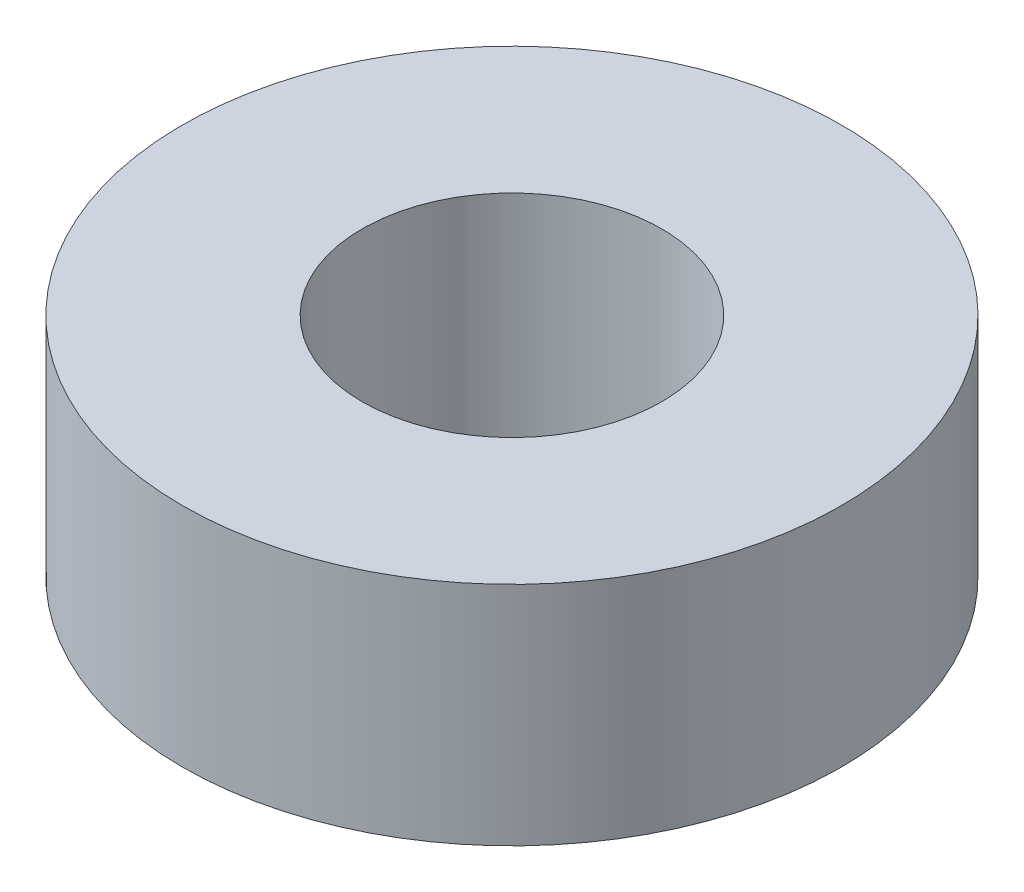
ISO-10303-21;
HEADER;
FILE_DESCRIPTION(('STEP AP214'),'2;1');
FILE_NAME('part.step','',(''),(''),'','','');
FILE_SCHEMA(('AUTOMOTIVE_DESIGN { 1 0 10303 214 1 1 1 1 }'));
ENDSEC;
DATA;
#1=APPLICATION_CONTEXT('core data for automotive mechanical design processes');
#2=APPLICATION_PROTOCOL_DEFINITION('international standard','automotive_design',2000,#1);
#3=PRODUCT_CONTEXT('',#1,'mechanical');
#4=PRODUCT('Part','Part','',(#3));
#5=PRODUCT_RELATED_PRODUCT_CATEGORY('part','',(#4));
#6=PRODUCT_DEFINITION_FORMATION('','',#4);
#7=PRODUCT_DEFINITION_CONTEXT('part definition',#1,'design');
#8=PRODUCT_DEFINITION('design','',#6,#7);
#9=PRODUCT_DEFINITION_SHAPE('','',#8);
#10=(LENGTH_UNIT() NAMED_UNIT(*) SI_UNIT(.MILLI.,.METRE.));
#11=(NAMED_UNIT(*) PLANE_ANGLE_UNIT() SI_UNIT($,.RADIAN.));
#12=(NAMED_UNIT(*) SI_UNIT($,.STERADIAN.) SOLID_ANGLE_UNIT());
#13=UNCERTAINTY_MEASURE_WITH_UNIT(LENGTH_MEASURE(1.E-05),#10,'distance_accuracy_value','');
#14=(GEOMETRIC_REPRESENTATION_CONTEXT(3) GLOBAL_UNCERTAINTY_ASSIGNED_CONTEXT((#13)) GLOBAL_UNIT_ASSIGNED_CONTEXT((#10,
#11,#12)) REPRESENTATION_CONTEXT('',''));
#15=CARTESIAN_POINT('',(0.,0.,0.));
#16=DIRECTION('',(0.,0.,1.));
#17=DIRECTION('',(1.,0.,0.));
#18=AXIS2_PLACEMENT_3D('',#15,#16,#17);
#19=CARTESIAN_POINT('',(0.,12.,0.));
#20=DIRECTION('',(0.,1.,0.));
#21=DIRECTION('',(0.,0.,1.));
#22=AXIS2_PLACEMENT_3D('',#19,#20,#21);
#23=PLANE('',#22);
#24=CARTESIAN_POINT('',(0.,12.,0.));
#25=DIRECTION('',(0.,1.,0.));
#26=DIRECTION('',(0.,0.,1.));
#27=AXIS2_PLACEMENT_3D('',#24,#25,#26);
#28=CIRCLE('',#27,17.4625);
#29=CARTESIAN_POINT('',(0.,12.,17.4625));
#30=VERTEX_POINT('',#29);
#31=EDGE_CURVE('E10',#30,#30,#28,.T.);
#32=ORIENTED_EDGE('',*,*,#31,.T.);
#33=EDGE_LOOP('',(#32));
#34=FACE_BOUND('',#33,.T.);
#35=CARTESIAN_POINT('',(0.,12.,0.));
#36=DIRECTION('',(0.,1.,0.));
#37=DIRECTION('',(0.,0.,1.));
#38=AXIS2_PLACEMENT_3D('',#35,#36,#37);
#39=CIRCLE('',#38,7.9375);
#40=CARTESIAN_POINT('',(0.,12.,7.9375));
#41=VERTEX_POINT('',#40);
#42=EDGE_CURVE('E42',#41,#41,#39,.T.);
#43=ORIENTED_EDGE('',*,*,#42,.F.);
#44=EDGE_LOOP('',(#43));
#45=FACE_BOUND('',#44,.T.);
#46=ADVANCED_FACE('F31',(#34,#45),#23,.T.);
#47=CARTESIAN_POINT('',(0.,0.,0.));
#48=DIRECTION('',(0.,1.,0.));
#49=DIRECTION('',(0.,0.,1.));
#50=AXIS2_PLACEMENT_3D('',#47,#48,#49);
#51=PLANE('',#50);
#52=CARTESIAN_POINT('',(0.,0.,0.));
#53=DIRECTION('',(0.,1.,0.));
#54=DIRECTION('',(0.,0.,1.));
#55=AXIS2_PLACEMENT_3D('',#52,#53,#54);
#56=CIRCLE('',#55,17.4625);
#57=CARTESIAN_POINT('',(0.,0.,17.4625));
#58=VERTEX_POINT('',#57);
#59=EDGE_CURVE('E35',#58,#58,#56,.T.);
#60=ORIENTED_EDGE('',*,*,#59,.F.);
#61=EDGE_LOOP('',(#60));
#62=FACE_BOUND('',#61,.T.);
#63=CARTESIAN_POINT('',(0.,0.,0.));
#64=DIRECTION('',(0.,1.,0.));
#65=DIRECTION('',(0.,0.,1.));
#66=AXIS2_PLACEMENT_3D('',#63,#64,#65);
#67=CIRCLE('',#66,7.9375);
#68=CARTESIAN_POINT('',(0.,0.,7.9375));
#69=VERTEX_POINT('',#68);
#70=EDGE_CURVE('E44',#69,#69,#67,.T.);
#71=ORIENTED_EDGE('',*,*,#70,.T.);
#72=EDGE_LOOP('',(#71));
#73=FACE_BOUND('',#72,.T.);
#74=ADVANCED_FACE('F54',(#62,#73),#51,.F.);
#75=CARTESIAN_POINT('',(0.,12.,0.));
#76=DIRECTION('',(0.,-1.,0.));
#77=DIRECTION('',(0.,0.,-1.));
#78=AXIS2_PLACEMENT_3D('',#75,#76,#77);
#79=CYLINDRICAL_SURFACE('',#78,17.4625);
#80=ORIENTED_EDGE('',*,*,#31,.F.);
#81=EDGE_LOOP('',(#80));
#82=FACE_BOUND('',#81,.T.);
#83=ORIENTED_EDGE('',*,*,#59,.T.);
#84=EDGE_LOOP('',(#83));
#85=FACE_BOUND('',#84,.T.);
#86=ADVANCED_FACE('F33',(#82,#85),#79,.T.);
#87=CARTESIAN_POINT('',(0.,12.,0.));
#88=DIRECTION('',(0.,-1.,0.));
#89=DIRECTION('',(0.,0.,-1.));
#90=AXIS2_PLACEMENT_3D('',#87,#88,#89);
#91=CYLINDRICAL_SURFACE('',#90,7.9375);
#92=ORIENTED_EDGE('',*,*,#42,.T.);
#93=EDGE_LOOP('',(#92));
#94=FACE_BOUND('',#93,.T.);
#95=ORIENTED_EDGE('',*,*,#70,.F.);
#96=EDGE_LOOP('',(#95));
#97=FACE_BOUND('',#96,.T.);
#98=ADVANCED_FACE('F50',(#94,#97),#91,.F.);
#99=CLOSED_SHELL('',(#46,#74,#86,#98));
#100=MANIFOLD_SOLID_BREP('B2',#99);
#101=ADVANCED_BREP_SHAPE_REPRESENTATION('',(#18,#100),#14);
#102=SHAPE_DEFINITION_REPRESENTATION(#9,#101);
ENDSEC;
END-ISO-10303-21;
